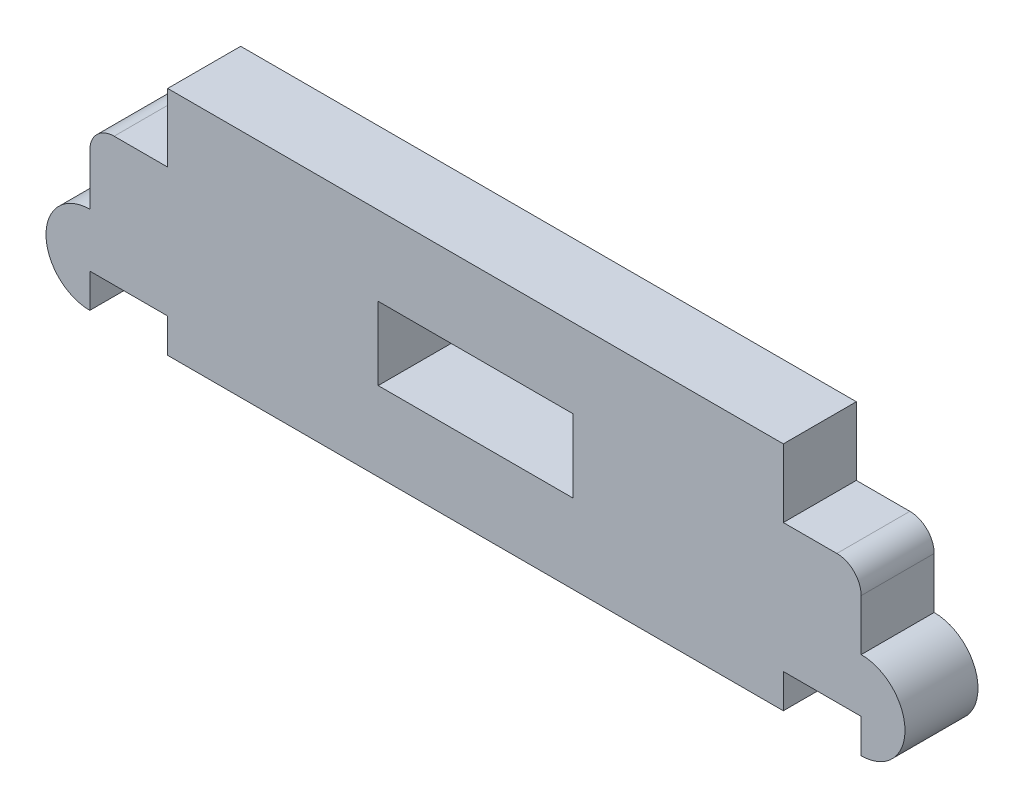
ISO-10303-21;
HEADER;
FILE_DESCRIPTION(('STEP AP214'),'2;1');
FILE_NAME('part.step','',(''),(''),'','','');
FILE_SCHEMA(('AUTOMOTIVE_DESIGN { 1 0 10303 214 1 1 1 1 }'));
ENDSEC;
DATA;
#1=APPLICATION_CONTEXT('core data for automotive mechanical design processes');
#2=APPLICATION_PROTOCOL_DEFINITION('international standard','automotive_design',2000,#1);
#3=PRODUCT_CONTEXT('',#1,'mechanical');
#4=PRODUCT('Part','Part','',(#3));
#5=PRODUCT_RELATED_PRODUCT_CATEGORY('part','',(#4));
#6=PRODUCT_DEFINITION_FORMATION('','',#4);
#7=PRODUCT_DEFINITION_CONTEXT('part definition',#1,'design');
#8=PRODUCT_DEFINITION('design','',#6,#7);
#9=PRODUCT_DEFINITION_SHAPE('','',#8);
#10=(LENGTH_UNIT() NAMED_UNIT(*) SI_UNIT(.MILLI.,.METRE.));
#11=(NAMED_UNIT(*) PLANE_ANGLE_UNIT() SI_UNIT($,.RADIAN.));
#12=(NAMED_UNIT(*) SI_UNIT($,.STERADIAN.) SOLID_ANGLE_UNIT());
#13=UNCERTAINTY_MEASURE_WITH_UNIT(LENGTH_MEASURE(1.E-05),#10,'distance_accuracy_value','');
#14=(GEOMETRIC_REPRESENTATION_CONTEXT(3) GLOBAL_UNCERTAINTY_ASSIGNED_CONTEXT((#13)) GLOBAL_UNIT_ASSIGNED_CONTEXT((#10,
#11,#12)) REPRESENTATION_CONTEXT('',''));
#15=CARTESIAN_POINT('',(0.,0.,0.));
#16=DIRECTION('',(0.,0.,1.));
#17=DIRECTION('',(1.,0.,0.));
#18=AXIS2_PLACEMENT_3D('',#15,#16,#17);
#19=CARTESIAN_POINT('',(12.65,-4.75,3.));
#20=DIRECTION('',(-1.,0.,0.));
#21=DIRECTION('',(0.,0.,1.));
#22=AXIS2_PLACEMENT_3D('',#19,#20,#21);
#23=PLANE('',#22);
#24=DIRECTION('',(0.,0.,-1.));
#25=VECTOR('',#24,1.);
#26=CARTESIAN_POINT('',(12.65,-3.35,3.));
#27=LINE('',#26,#25);
#28=CARTESIAN_POINT('',(12.65,-3.35,3.));
#29=VERTEX_POINT('',#28);
#30=CARTESIAN_POINT('',(12.65,-3.35,0.));
#31=VERTEX_POINT('',#30);
#32=EDGE_CURVE('E182',#29,#31,#27,.T.);
#33=ORIENTED_EDGE('',*,*,#32,.F.);
#34=DIRECTION('',(0.,1.,0.));
#35=VECTOR('',#34,1.);
#36=CARTESIAN_POINT('',(12.65,-4.75,3.));
#37=LINE('',#36,#35);
#38=CARTESIAN_POINT('',(12.65,-4.75,3.));
#39=VERTEX_POINT('',#38);
#40=EDGE_CURVE('E196',#39,#29,#37,.T.);
#41=ORIENTED_EDGE('',*,*,#40,.F.);
#42=DIRECTION('',(0.,0.,-1.));
#43=VECTOR('',#42,1.);
#44=CARTESIAN_POINT('',(12.65,-4.75,3.));
#45=LINE('',#44,#43);
#46=CARTESIAN_POINT('',(12.65,-4.75,0.));
#47=VERTEX_POINT('',#46);
#48=EDGE_CURVE('E220',#39,#47,#45,.T.);
#49=ORIENTED_EDGE('',*,*,#48,.T.);
#50=DIRECTION('',(0.,1.,0.));
#51=VECTOR('',#50,1.);
#52=CARTESIAN_POINT('',(12.65,-4.75,0.));
#53=LINE('',#52,#51);
#54=EDGE_CURVE('E198',#47,#31,#53,.T.);
#55=ORIENTED_EDGE('',*,*,#54,.T.);
#56=EDGE_LOOP('',(#33,#41,#49,#55));
#57=FACE_BOUND('',#56,.T.);
#58=ADVANCED_FACE('F32',(#57),#23,.F.);
#59=CARTESIAN_POINT('',(-12.65,-4.75,3.));
#60=DIRECTION('',(1.,0.,0.));
#61=DIRECTION('',(0.,0.,-1.));
#62=AXIS2_PLACEMENT_3D('',#59,#60,#61);
#63=PLANE('',#62);
#64=DIRECTION('',(0.,0.,-1.));
#65=VECTOR('',#64,1.);
#66=CARTESIAN_POINT('',(-12.65,1.95,3.));
#67=LINE('',#66,#65);
#68=CARTESIAN_POINT('',(-12.65,1.95,3.));
#69=VERTEX_POINT('',#68);
#70=CARTESIAN_POINT('',(-12.65,1.95,0.));
#71=VERTEX_POINT('',#70);
#72=EDGE_CURVE('E312',#69,#71,#67,.T.);
#73=ORIENTED_EDGE('',*,*,#72,.F.);
#74=DIRECTION('',(0.,-1.,0.));
#75=VECTOR('',#74,1.);
#76=CARTESIAN_POINT('',(-12.65,-4.75,3.));
#77=LINE('',#76,#75);
#78=CARTESIAN_POINT('',(-12.65,4.75,3.));
#79=VERTEX_POINT('',#78);
#80=EDGE_CURVE('E216',#79,#69,#77,.T.);
#81=ORIENTED_EDGE('',*,*,#80,.F.);
#82=DIRECTION('',(0.,0.,-1.));
#83=VECTOR('',#82,1.);
#84=CARTESIAN_POINT('',(-12.65,4.75,3.));
#85=LINE('',#84,#83);
#86=CARTESIAN_POINT('',(-12.65,4.75,0.));
#87=VERTEX_POINT('',#86);
#88=EDGE_CURVE('E234',#79,#87,#85,.T.);
#89=ORIENTED_EDGE('',*,*,#88,.T.);
#90=DIRECTION('',(0.,-1.,0.));
#91=VECTOR('',#90,1.);
#92=CARTESIAN_POINT('',(-12.65,-4.75,0.));
#93=LINE('',#92,#91);
#94=EDGE_CURVE('E226',#87,#71,#93,.T.);
#95=ORIENTED_EDGE('',*,*,#94,.T.);
#96=EDGE_LOOP('',(#73,#81,#89,#95));
#97=FACE_BOUND('',#96,.T.);
#98=ADVANCED_FACE('F414',(#97),#63,.F.);
#99=CARTESIAN_POINT('',(0.,0.,3.));
#100=DIRECTION('',(0.,0.,-1.));
#101=DIRECTION('',(-1.,0.,0.));
#102=AXIS2_PLACEMENT_3D('',#99,#100,#101);
#103=PLANE('',#102);
#104=DIRECTION('',(0.,-1.,0.));
#105=VECTOR('',#104,1.);
#106=CARTESIAN_POINT('',(15.85,-1.15,3.));
#107=LINE('',#106,#105);
#108=CARTESIAN_POINT('',(15.85,0.95,3.));
#109=VERTEX_POINT('',#108);
#110=CARTESIAN_POINT('',(15.85,-1.15,3.));
#111=VERTEX_POINT('',#110);
#112=EDGE_CURVE('E357',#109,#111,#107,.T.);
#113=ORIENTED_EDGE('',*,*,#112,.F.);
#114=CARTESIAN_POINT('',(14.85,0.95,3.));
#115=DIRECTION('',(0.,0.,-1.));
#116=DIRECTION('',(-1.,0.,0.));
#117=AXIS2_PLACEMENT_3D('',#114,#115,#116);
#118=CIRCLE('',#117,1.);
#119=CARTESIAN_POINT('',(14.85,1.95,3.));
#120=VERTEX_POINT('',#119);
#121=EDGE_CURVE('E11',#109,#120,#118,.F.);
#122=ORIENTED_EDGE('',*,*,#121,.T.);
#123=DIRECTION('',(1.,0.,0.));
#124=VECTOR('',#123,1.);
#125=CARTESIAN_POINT('',(15.85,1.95,3.));
#126=LINE('',#125,#124);
#127=CARTESIAN_POINT('',(12.65,1.95,3.));
#128=VERTEX_POINT('',#127);
#129=EDGE_CURVE('E258',#128,#120,#126,.T.);
#130=ORIENTED_EDGE('',*,*,#129,.F.);
#131=CARTESIAN_POINT('',(12.65,4.75,3.));
#132=VERTEX_POINT('',#131);
#133=EDGE_CURVE('E207',#128,#132,#37,.T.);
#134=ORIENTED_EDGE('',*,*,#133,.T.);
#135=DIRECTION('',(-1.,0.,0.));
#136=VECTOR('',#135,1.);
#137=CARTESIAN_POINT('',(-12.65,4.75,3.));
#138=LINE('',#137,#136);
#139=EDGE_CURVE('E206',#132,#79,#138,.T.);
#140=ORIENTED_EDGE('',*,*,#139,.T.);
#141=ORIENTED_EDGE('',*,*,#80,.T.);
#142=DIRECTION('',(-1.,0.,0.));
#143=VECTOR('',#142,1.);
#144=CARTESIAN_POINT('',(-15.85,1.95,3.));
#145=LINE('',#144,#143);
#146=CARTESIAN_POINT('',(-14.85,1.95,3.));
#147=VERTEX_POINT('',#146);
#148=EDGE_CURVE('E279',#69,#147,#145,.T.);
#149=ORIENTED_EDGE('',*,*,#148,.T.);
#150=CARTESIAN_POINT('',(-14.85,0.95,3.));
#151=DIRECTION('',(0.,0.,-1.));
#152=DIRECTION('',(-1.,0.,0.));
#153=AXIS2_PLACEMENT_3D('',#150,#151,#152);
#154=CIRCLE('',#153,1.);
#155=CARTESIAN_POINT('',(-15.85,0.95,3.));
#156=VERTEX_POINT('',#155);
#157=EDGE_CURVE('E247',#147,#156,#154,.F.);
#158=ORIENTED_EDGE('',*,*,#157,.T.);
#159=DIRECTION('',(0.,-1.,0.));
#160=VECTOR('',#159,1.);
#161=CARTESIAN_POINT('',(-15.85,-1.15,3.));
#162=LINE('',#161,#160);
#163=CARTESIAN_POINT('',(-15.85,-1.15,3.));
#164=VERTEX_POINT('',#163);
#165=EDGE_CURVE('E282',#156,#164,#162,.T.);
#166=ORIENTED_EDGE('',*,*,#165,.T.);
#167=CARTESIAN_POINT('',(-15.85,-2.95,3.));
#168=DIRECTION('',(0.,0.,1.));
#169=DIRECTION('',(-1.,0.,0.));
#170=AXIS2_PLACEMENT_3D('',#167,#168,#169);
#171=CIRCLE('',#170,1.8);
#172=CARTESIAN_POINT('',(-15.85,-4.75,3.));
#173=VERTEX_POINT('',#172);
#174=EDGE_CURVE('E285',#164,#173,#171,.T.);
#175=ORIENTED_EDGE('',*,*,#174,.T.);
#176=DIRECTION('',(0.,1.,0.));
#177=VECTOR('',#176,1.);
#178=CARTESIAN_POINT('',(-15.85,-3.35,3.));
#179=LINE('',#178,#177);
#180=CARTESIAN_POINT('',(-15.85,-3.35,3.));
#181=VERTEX_POINT('',#180);
#182=EDGE_CURVE('E287',#173,#181,#179,.T.);
#183=ORIENTED_EDGE('',*,*,#182,.T.);
#184=DIRECTION('',(1.,0.,0.));
#185=VECTOR('',#184,1.);
#186=CARTESIAN_POINT('',(-12.65,-3.35,3.));
#187=LINE('',#186,#185);
#188=CARTESIAN_POINT('',(-12.65,-3.35,3.));
#189=VERTEX_POINT('',#188);
#190=EDGE_CURVE('E289',#181,#189,#187,.T.);
#191=ORIENTED_EDGE('',*,*,#190,.T.);
#192=CARTESIAN_POINT('',(-12.65,-4.75,3.));
#193=VERTEX_POINT('',#192);
#194=EDGE_CURVE('E209',#189,#193,#77,.T.);
#195=ORIENTED_EDGE('',*,*,#194,.T.);
#196=DIRECTION('',(1.,0.,0.));
#197=VECTOR('',#196,1.);
#198=CARTESIAN_POINT('',(-12.65,-4.75,3.));
#199=LINE('',#198,#197);
#200=EDGE_CURVE('E204',#193,#39,#199,.T.);
#201=ORIENTED_EDGE('',*,*,#200,.T.);
#202=ORIENTED_EDGE('',*,*,#40,.T.);
#203=DIRECTION('',(-1.,0.,0.));
#204=VECTOR('',#203,1.);
#205=CARTESIAN_POINT('',(12.65,-3.35,3.));
#206=LINE('',#205,#204);
#207=CARTESIAN_POINT('',(15.85,-3.35,3.));
#208=VERTEX_POINT('',#207);
#209=EDGE_CURVE('E178',#208,#29,#206,.T.);
#210=ORIENTED_EDGE('',*,*,#209,.F.);
#211=DIRECTION('',(0.,1.,0.));
#212=VECTOR('',#211,1.);
#213=CARTESIAN_POINT('',(15.85,-3.35,3.));
#214=LINE('',#213,#212);
#215=CARTESIAN_POINT('',(15.85,-4.75,3.));
#216=VERTEX_POINT('',#215);
#217=EDGE_CURVE('E189',#216,#208,#214,.T.);
#218=ORIENTED_EDGE('',*,*,#217,.F.);
#219=CARTESIAN_POINT('',(15.85,-2.95,3.));
#220=DIRECTION('',(0.,0.,-1.));
#221=DIRECTION('',(1.,0.,0.));
#222=AXIS2_PLACEMENT_3D('',#219,#220,#221);
#223=CIRCLE('',#222,1.8);
#224=EDGE_CURVE('E359',#111,#216,#223,.T.);
#225=ORIENTED_EDGE('',*,*,#224,.F.);
#226=EDGE_LOOP('',(#113,#122,#130,#134,#140,#141,#149,#158,#166,#175,#183,#191,#195,#201,#202,
#210,#218,#225));
#227=FACE_BOUND('',#226,.T.);
#228=DIRECTION('',(0.,1.,0.));
#229=VECTOR('',#228,1.);
#230=CARTESIAN_POINT('',(4.,-1.5,3.));
#231=LINE('',#230,#229);
#232=CARTESIAN_POINT('',(4.,-1.5,3.));
#233=VERTEX_POINT('',#232);
#234=CARTESIAN_POINT('',(4.,1.5,3.));
#235=VERTEX_POINT('',#234);
#236=EDGE_CURVE('E316',#233,#235,#231,.T.);
#237=ORIENTED_EDGE('',*,*,#236,.F.);
#238=DIRECTION('',(1.,0.,0.));
#239=VECTOR('',#238,1.);
#240=CARTESIAN_POINT('',(-4.,-1.5,3.));
#241=LINE('',#240,#239);
#242=CARTESIAN_POINT('',(-4.,-1.5,3.));
#243=VERTEX_POINT('',#242);
#244=EDGE_CURVE('E324',#243,#233,#241,.T.);
#245=ORIENTED_EDGE('',*,*,#244,.F.);
#246=DIRECTION('',(0.,-1.,0.));
#247=VECTOR('',#246,1.);
#248=CARTESIAN_POINT('',(-4.,-1.5,3.));
#249=LINE('',#248,#247);
#250=CARTESIAN_POINT('',(-4.,1.5,3.));
#251=VERTEX_POINT('',#250);
#252=EDGE_CURVE('E321',#251,#243,#249,.T.);
#253=ORIENTED_EDGE('',*,*,#252,.F.);
#254=DIRECTION('',(-1.,0.,0.));
#255=VECTOR('',#254,1.);
#256=CARTESIAN_POINT('',(-4.,1.5,3.));
#257=LINE('',#256,#255);
#258=EDGE_CURVE('E318',#235,#251,#257,.T.);
#259=ORIENTED_EDGE('',*,*,#258,.F.);
#260=EDGE_LOOP('',(#237,#245,#253,#259));
#261=FACE_BOUND('',#260,.T.);
#262=ADVANCED_FACE('F201',(#227,#261),#103,.F.);
#263=CARTESIAN_POINT('',(0.,0.,0.));
#264=DIRECTION('',(0.,0.,-1.));
#265=DIRECTION('',(-1.,0.,0.));
#266=AXIS2_PLACEMENT_3D('',#263,#264,#265);
#267=PLANE('',#266);
#268=DIRECTION('',(1.,0.,0.));
#269=VECTOR('',#268,1.);
#270=CARTESIAN_POINT('',(15.85,1.95,0.));
#271=LINE('',#270,#269);
#272=CARTESIAN_POINT('',(12.65,1.95,0.));
#273=VERTEX_POINT('',#272);
#274=CARTESIAN_POINT('',(14.85,1.95,0.));
#275=VERTEX_POINT('',#274);
#276=EDGE_CURVE('E190',#273,#275,#271,.T.);
#277=ORIENTED_EDGE('',*,*,#276,.T.);
#278=CARTESIAN_POINT('',(14.85,0.95,0.));
#279=DIRECTION('',(0.,0.,-1.));
#280=DIRECTION('',(-1.,0.,0.));
#281=AXIS2_PLACEMENT_3D('',#278,#279,#280);
#282=CIRCLE('',#281,1.);
#283=CARTESIAN_POINT('',(15.85,0.95,0.));
#284=VERTEX_POINT('',#283);
#285=EDGE_CURVE('E54',#275,#284,#282,.T.);
#286=ORIENTED_EDGE('',*,*,#285,.T.);
#287=DIRECTION('',(0.,-1.,0.));
#288=VECTOR('',#287,1.);
#289=CARTESIAN_POINT('',(15.85,-1.15,0.));
#290=LINE('',#289,#288);
#291=CARTESIAN_POINT('',(15.85,-1.15,0.));
#292=VERTEX_POINT('',#291);
#293=EDGE_CURVE('E265',#284,#292,#290,.T.);
#294=ORIENTED_EDGE('',*,*,#293,.T.);
#295=CARTESIAN_POINT('',(15.85,-2.95,0.));
#296=DIRECTION('',(0.,0.,-1.));
#297=DIRECTION('',(1.,0.,0.));
#298=AXIS2_PLACEMENT_3D('',#295,#296,#297);
#299=CIRCLE('',#298,1.8);
#300=CARTESIAN_POINT('',(15.85,-4.75,0.));
#301=VERTEX_POINT('',#300);
#302=EDGE_CURVE('E267',#292,#301,#299,.T.);
#303=ORIENTED_EDGE('',*,*,#302,.T.);
#304=DIRECTION('',(0.,1.,0.));
#305=VECTOR('',#304,1.);
#306=CARTESIAN_POINT('',(15.85,-3.35,0.));
#307=LINE('',#306,#305);
#308=CARTESIAN_POINT('',(15.85,-3.35,0.));
#309=VERTEX_POINT('',#308);
#310=EDGE_CURVE('E365',#301,#309,#307,.T.);
#311=ORIENTED_EDGE('',*,*,#310,.T.);
#312=DIRECTION('',(-1.,0.,0.));
#313=VECTOR('',#312,1.);
#314=CARTESIAN_POINT('',(12.65,-3.35,0.));
#315=LINE('',#314,#313);
#316=EDGE_CURVE('E363',#309,#31,#315,.T.);
#317=ORIENTED_EDGE('',*,*,#316,.T.);
#318=ORIENTED_EDGE('',*,*,#54,.F.);
#319=DIRECTION('',(1.,0.,0.));
#320=VECTOR('',#319,1.);
#321=CARTESIAN_POINT('',(-12.65,-4.75,0.));
#322=LINE('',#321,#320);
#323=CARTESIAN_POINT('',(-12.65,-4.75,0.));
#324=VERTEX_POINT('',#323);
#325=EDGE_CURVE('E211',#324,#47,#322,.T.);
#326=ORIENTED_EDGE('',*,*,#325,.F.);
#327=CARTESIAN_POINT('',(-12.65,-3.35,0.));
#328=VERTEX_POINT('',#327);
#329=EDGE_CURVE('E225',#328,#324,#93,.T.);
#330=ORIENTED_EDGE('',*,*,#329,.F.);
#331=DIRECTION('',(1.,0.,0.));
#332=VECTOR('',#331,1.);
#333=CARTESIAN_POINT('',(-12.65,-3.35,0.));
#334=LINE('',#333,#332);
#335=CARTESIAN_POINT('',(-15.85,-3.35,0.));
#336=VERTEX_POINT('',#335);
#337=EDGE_CURVE('E283',#336,#328,#334,.T.);
#338=ORIENTED_EDGE('',*,*,#337,.F.);
#339=DIRECTION('',(0.,1.,0.));
#340=VECTOR('',#339,1.);
#341=CARTESIAN_POINT('',(-15.85,-3.35,0.));
#342=LINE('',#341,#340);
#343=CARTESIAN_POINT('',(-15.85,-4.75,0.));
#344=VERTEX_POINT('',#343);
#345=EDGE_CURVE('E298',#344,#336,#342,.T.);
#346=ORIENTED_EDGE('',*,*,#345,.F.);
#347=CARTESIAN_POINT('',(-15.85,-2.95,0.));
#348=DIRECTION('',(0.,0.,1.));
#349=DIRECTION('',(-1.,0.,0.));
#350=AXIS2_PLACEMENT_3D('',#347,#348,#349);
#351=CIRCLE('',#350,1.8);
#352=CARTESIAN_POINT('',(-15.85,-1.15,0.));
#353=VERTEX_POINT('',#352);
#354=EDGE_CURVE('E296',#353,#344,#351,.T.);
#355=ORIENTED_EDGE('',*,*,#354,.F.);
#356=DIRECTION('',(0.,-1.,0.));
#357=VECTOR('',#356,1.);
#358=CARTESIAN_POINT('',(-15.85,-1.15,0.));
#359=LINE('',#358,#357);
#360=CARTESIAN_POINT('',(-15.85,0.95,0.));
#361=VERTEX_POINT('',#360);
#362=EDGE_CURVE('E294',#361,#353,#359,.T.);
#363=ORIENTED_EDGE('',*,*,#362,.F.);
#364=CARTESIAN_POINT('',(-14.85,0.95,0.));
#365=DIRECTION('',(0.,0.,-1.));
#366=DIRECTION('',(-1.,0.,0.));
#367=AXIS2_PLACEMENT_3D('',#364,#365,#366);
#368=CIRCLE('',#367,1.);
#369=CARTESIAN_POINT('',(-14.85,1.95,0.));
#370=VERTEX_POINT('',#369);
#371=EDGE_CURVE('E243',#361,#370,#368,.T.);
#372=ORIENTED_EDGE('',*,*,#371,.T.);
#373=DIRECTION('',(-1.,0.,0.));
#374=VECTOR('',#373,1.);
#375=CARTESIAN_POINT('',(-15.85,1.95,0.));
#376=LINE('',#375,#374);
#377=EDGE_CURVE('E199',#71,#370,#376,.T.);
#378=ORIENTED_EDGE('',*,*,#377,.F.);
#379=ORIENTED_EDGE('',*,*,#94,.F.);
#380=DIRECTION('',(-1.,0.,0.));
#381=VECTOR('',#380,1.);
#382=CARTESIAN_POINT('',(-12.65,4.75,0.));
#383=LINE('',#382,#381);
#384=CARTESIAN_POINT('',(12.65,4.75,0.));
#385=VERTEX_POINT('',#384);
#386=EDGE_CURVE('E222',#385,#87,#383,.T.);
#387=ORIENTED_EDGE('',*,*,#386,.F.);
#388=EDGE_CURVE('E223',#273,#385,#53,.T.);
#389=ORIENTED_EDGE('',*,*,#388,.F.);
#390=EDGE_LOOP('',(#277,#286,#294,#303,#311,#317,#318,#326,#330,#338,#346,#355,#363,#372,#378,
#379,#387,#389));
#391=FACE_BOUND('',#390,.T.);
#392=DIRECTION('',(1.,0.,0.));
#393=VECTOR('',#392,1.);
#394=CARTESIAN_POINT('',(-4.,-1.5,0.));
#395=LINE('',#394,#393);
#396=CARTESIAN_POINT('',(-4.,-1.5,0.));
#397=VERTEX_POINT('',#396);
#398=CARTESIAN_POINT('',(4.,-1.5,0.));
#399=VERTEX_POINT('',#398);
#400=EDGE_CURVE('E319',#397,#399,#395,.T.);
#401=ORIENTED_EDGE('',*,*,#400,.T.);
#402=DIRECTION('',(0.,1.,0.));
#403=VECTOR('',#402,1.);
#404=CARTESIAN_POINT('',(4.,-1.5,0.));
#405=LINE('',#404,#403);
#406=CARTESIAN_POINT('',(4.,1.5,0.));
#407=VERTEX_POINT('',#406);
#408=EDGE_CURVE('E315',#399,#407,#405,.T.);
#409=ORIENTED_EDGE('',*,*,#408,.T.);
#410=DIRECTION('',(-1.,0.,0.));
#411=VECTOR('',#410,1.);
#412=CARTESIAN_POINT('',(-4.,1.5,0.));
#413=LINE('',#412,#411);
#414=CARTESIAN_POINT('',(-4.,1.5,0.));
#415=VERTEX_POINT('',#414);
#416=EDGE_CURVE('E329',#407,#415,#413,.T.);
#417=ORIENTED_EDGE('',*,*,#416,.T.);
#418=DIRECTION('',(0.,-1.,0.));
#419=VECTOR('',#418,1.);
#420=CARTESIAN_POINT('',(-4.,-1.5,0.));
#421=LINE('',#420,#419);
#422=EDGE_CURVE('E332',#415,#397,#421,.T.);
#423=ORIENTED_EDGE('',*,*,#422,.T.);
#424=EDGE_LOOP('',(#401,#409,#417,#423));
#425=FACE_BOUND('',#424,.T.);
#426=ADVANCED_FACE('F262',(#391,#425),#267,.T.);
#427=ORIENTED_EDGE('',*,*,#133,.F.);
#428=DIRECTION('',(0.,0.,-1.));
#429=VECTOR('',#428,1.);
#430=CARTESIAN_POINT('',(12.65,1.95,3.));
#431=LINE('',#430,#429);
#432=EDGE_CURVE('E271',#128,#273,#431,.T.);
#433=ORIENTED_EDGE('',*,*,#432,.T.);
#434=ORIENTED_EDGE('',*,*,#388,.T.);
#435=DIRECTION('',(0.,0.,-1.));
#436=VECTOR('',#435,1.);
#437=CARTESIAN_POINT('',(12.65,4.75,3.));
#438=LINE('',#437,#436);
#439=EDGE_CURVE('E237',#132,#385,#438,.T.);
#440=ORIENTED_EDGE('',*,*,#439,.F.);
#441=EDGE_LOOP('',(#427,#433,#434,#440));
#442=FACE_BOUND('',#441,.T.);
#443=ADVANCED_FACE('F350',(#442),#23,.F.);
#444=CARTESIAN_POINT('',(-12.65,4.75,3.));
#445=DIRECTION('',(0.,-1.,0.));
#446=DIRECTION('',(0.,0.,-1.));
#447=AXIS2_PLACEMENT_3D('',#444,#445,#446);
#448=PLANE('',#447);
#449=ORIENTED_EDGE('',*,*,#386,.T.);
#450=ORIENTED_EDGE('',*,*,#88,.F.);
#451=ORIENTED_EDGE('',*,*,#139,.F.);
#452=ORIENTED_EDGE('',*,*,#439,.T.);
#453=EDGE_LOOP('',(#449,#450,#451,#452));
#454=FACE_BOUND('',#453,.T.);
#455=ADVANCED_FACE('F355',(#454),#448,.F.);
#456=ORIENTED_EDGE('',*,*,#194,.F.);
#457=DIRECTION('',(0.,0.,-1.));
#458=VECTOR('',#457,1.);
#459=CARTESIAN_POINT('',(-12.65,-3.35,3.));
#460=LINE('',#459,#458);
#461=EDGE_CURVE('E291',#189,#328,#460,.T.);
#462=ORIENTED_EDGE('',*,*,#461,.T.);
#463=ORIENTED_EDGE('',*,*,#329,.T.);
#464=DIRECTION('',(0.,0.,-1.));
#465=VECTOR('',#464,1.);
#466=CARTESIAN_POINT('',(-12.65,-4.75,3.));
#467=LINE('',#466,#465);
#468=EDGE_CURVE('E231',#193,#324,#467,.T.);
#469=ORIENTED_EDGE('',*,*,#468,.F.);
#470=EDGE_LOOP('',(#456,#462,#463,#469));
#471=FACE_BOUND('',#470,.T.);
#472=ADVANCED_FACE('F385',(#471),#63,.F.);
#473=CARTESIAN_POINT('',(-12.65,-4.75,3.));
#474=DIRECTION('',(0.,1.,0.));
#475=DIRECTION('',(0.,0.,1.));
#476=AXIS2_PLACEMENT_3D('',#473,#474,#475);
#477=PLANE('',#476);
#478=ORIENTED_EDGE('',*,*,#325,.T.);
#479=ORIENTED_EDGE('',*,*,#48,.F.);
#480=ORIENTED_EDGE('',*,*,#200,.F.);
#481=ORIENTED_EDGE('',*,*,#468,.T.);
#482=EDGE_LOOP('',(#478,#479,#480,#481));
#483=FACE_BOUND('',#482,.T.);
#484=ADVANCED_FACE('F381',(#483),#477,.F.);
#485=CARTESIAN_POINT('',(4.,-1.5,3.));
#486=DIRECTION('',(-1.,0.,0.));
#487=DIRECTION('',(0.,0.,1.));
#488=AXIS2_PLACEMENT_3D('',#485,#486,#487);
#489=PLANE('',#488);
#490=ORIENTED_EDGE('',*,*,#408,.F.);
#491=DIRECTION('',(0.,0.,-1.));
#492=VECTOR('',#491,1.);
#493=CARTESIAN_POINT('',(4.,-1.5,3.));
#494=LINE('',#493,#492);
#495=EDGE_CURVE('E326',#233,#399,#494,.T.);
#496=ORIENTED_EDGE('',*,*,#495,.F.);
#497=ORIENTED_EDGE('',*,*,#236,.T.);
#498=DIRECTION('',(0.,0.,-1.));
#499=VECTOR('',#498,1.);
#500=CARTESIAN_POINT('',(4.,1.5,3.));
#501=LINE('',#500,#499);
#502=EDGE_CURVE('E213',#235,#407,#501,.T.);
#503=ORIENTED_EDGE('',*,*,#502,.T.);
#504=EDGE_LOOP('',(#490,#496,#497,#503));
#505=FACE_BOUND('',#504,.T.);
#506=ADVANCED_FACE('F430',(#505),#489,.T.);
#507=CARTESIAN_POINT('',(-4.,1.5,3.));
#508=DIRECTION('',(0.,-1.,0.));
#509=DIRECTION('',(0.,0.,-1.));
#510=AXIS2_PLACEMENT_3D('',#507,#508,#509);
#511=PLANE('',#510);
#512=ORIENTED_EDGE('',*,*,#416,.F.);
#513=ORIENTED_EDGE('',*,*,#502,.F.);
#514=ORIENTED_EDGE('',*,*,#258,.T.);
#515=DIRECTION('',(0.,0.,-1.));
#516=VECTOR('',#515,1.);
#517=CARTESIAN_POINT('',(-4.,1.5,3.));
#518=LINE('',#517,#516);
#519=EDGE_CURVE('E340',#251,#415,#518,.T.);
#520=ORIENTED_EDGE('',*,*,#519,.T.);
#521=EDGE_LOOP('',(#512,#513,#514,#520));
#522=FACE_BOUND('',#521,.T.);
#523=ADVANCED_FACE('F460',(#522),#511,.T.);
#524=CARTESIAN_POINT('',(-4.,-1.5,3.));
#525=DIRECTION('',(1.,0.,0.));
#526=DIRECTION('',(0.,0.,-1.));
#527=AXIS2_PLACEMENT_3D('',#524,#525,#526);
#528=PLANE('',#527);
#529=ORIENTED_EDGE('',*,*,#422,.F.);
#530=ORIENTED_EDGE('',*,*,#519,.F.);
#531=ORIENTED_EDGE('',*,*,#252,.T.);
#532=DIRECTION('',(0.,0.,-1.));
#533=VECTOR('',#532,1.);
#534=CARTESIAN_POINT('',(-4.,-1.5,3.));
#535=LINE('',#534,#533);
#536=EDGE_CURVE('E339',#243,#397,#535,.T.);
#537=ORIENTED_EDGE('',*,*,#536,.T.);
#538=EDGE_LOOP('',(#529,#530,#531,#537));
#539=FACE_BOUND('',#538,.T.);
#540=ADVANCED_FACE('F456',(#539),#528,.T.);
#541=CARTESIAN_POINT('',(-4.,-1.5,3.));
#542=DIRECTION('',(0.,1.,0.));
#543=DIRECTION('',(0.,0.,1.));
#544=AXIS2_PLACEMENT_3D('',#541,#542,#543);
#545=PLANE('',#544);
#546=ORIENTED_EDGE('',*,*,#400,.F.);
#547=ORIENTED_EDGE('',*,*,#536,.F.);
#548=ORIENTED_EDGE('',*,*,#244,.T.);
#549=ORIENTED_EDGE('',*,*,#495,.T.);
#550=EDGE_LOOP('',(#546,#547,#548,#549));
#551=FACE_BOUND('',#550,.T.);
#552=ADVANCED_FACE('F453',(#551),#545,.T.);
#553=CARTESIAN_POINT('',(-15.85,1.95,3.));
#554=DIRECTION('',(0.,-1.,0.));
#555=DIRECTION('',(0.,0.,-1.));
#556=AXIS2_PLACEMENT_3D('',#553,#554,#555);
#557=PLANE('',#556);
#558=ORIENTED_EDGE('',*,*,#377,.T.);
#559=DIRECTION('',(0.,0.,-1.));
#560=VECTOR('',#559,1.);
#561=CARTESIAN_POINT('',(-14.85,1.95,3.));
#562=LINE('',#561,#560);
#563=EDGE_CURVE('E245',#370,#147,#562,.F.);
#564=ORIENTED_EDGE('',*,*,#563,.T.);
#565=ORIENTED_EDGE('',*,*,#148,.F.);
#566=ORIENTED_EDGE('',*,*,#72,.T.);
#567=EDGE_LOOP('',(#558,#564,#565,#566));
#568=FACE_BOUND('',#567,.T.);
#569=ADVANCED_FACE('F409',(#568),#557,.F.);
#570=CARTESIAN_POINT('',(-15.85,-1.15,3.));
#571=DIRECTION('',(1.,0.,0.));
#572=DIRECTION('',(0.,0.,-1.));
#573=AXIS2_PLACEMENT_3D('',#570,#571,#572);
#574=PLANE('',#573);
#575=ORIENTED_EDGE('',*,*,#165,.F.);
#576=DIRECTION('',(0.,0.,-1.));
#577=VECTOR('',#576,1.);
#578=CARTESIAN_POINT('',(-15.85,0.95,3.));
#579=LINE('',#578,#577);
#580=EDGE_CURVE('E240',#156,#361,#579,.T.);
#581=ORIENTED_EDGE('',*,*,#580,.T.);
#582=ORIENTED_EDGE('',*,*,#362,.T.);
#583=DIRECTION('',(0.,0.,-1.));
#584=VECTOR('',#583,1.);
#585=CARTESIAN_POINT('',(-15.85,-1.15,3.));
#586=LINE('',#585,#584);
#587=EDGE_CURVE('E309',#164,#353,#586,.T.);
#588=ORIENTED_EDGE('',*,*,#587,.F.);
#589=EDGE_LOOP('',(#575,#581,#582,#588));
#590=FACE_BOUND('',#589,.T.);
#591=ADVANCED_FACE('F404',(#590),#574,.F.);
#592=CARTESIAN_POINT('',(-15.85,-2.95,3.));
#593=DIRECTION('',(0.,0.,-1.));
#594=DIRECTION('',(-1.,0.,0.));
#595=AXIS2_PLACEMENT_3D('',#592,#593,#594);
#596=CYLINDRICAL_SURFACE('',#595,1.8);
#597=ORIENTED_EDGE('',*,*,#354,.T.);
#598=DIRECTION('',(0.,0.,-1.));
#599=VECTOR('',#598,1.);
#600=CARTESIAN_POINT('',(-15.85,-4.75,3.));
#601=LINE('',#600,#599);
#602=EDGE_CURVE('E306',#173,#344,#601,.T.);
#603=ORIENTED_EDGE('',*,*,#602,.F.);
#604=ORIENTED_EDGE('',*,*,#174,.F.);
#605=ORIENTED_EDGE('',*,*,#587,.T.);
#606=EDGE_LOOP('',(#597,#603,#604,#605));
#607=FACE_BOUND('',#606,.T.);
#608=ADVANCED_FACE('F400',(#607),#596,.T.);
#609=CARTESIAN_POINT('',(-15.85,-3.35,3.));
#610=DIRECTION('',(-1.,0.,0.));
#611=DIRECTION('',(0.,0.,1.));
#612=AXIS2_PLACEMENT_3D('',#609,#610,#611);
#613=PLANE('',#612);
#614=ORIENTED_EDGE('',*,*,#345,.T.);
#615=DIRECTION('',(0.,0.,-1.));
#616=VECTOR('',#615,1.);
#617=CARTESIAN_POINT('',(-15.85,-3.35,3.));
#618=LINE('',#617,#616);
#619=EDGE_CURVE('E303',#181,#336,#618,.T.);
#620=ORIENTED_EDGE('',*,*,#619,.F.);
#621=ORIENTED_EDGE('',*,*,#182,.F.);
#622=ORIENTED_EDGE('',*,*,#602,.T.);
#623=EDGE_LOOP('',(#614,#620,#621,#622));
#624=FACE_BOUND('',#623,.T.);
#625=ADVANCED_FACE('F395',(#624),#613,.F.);
#626=CARTESIAN_POINT('',(-12.65,-3.35,3.));
#627=DIRECTION('',(0.,1.,0.));
#628=DIRECTION('',(-1.,0.,0.));
#629=AXIS2_PLACEMENT_3D('',#626,#627,#628);
#630=PLANE('',#629);
#631=ORIENTED_EDGE('',*,*,#337,.T.);
#632=ORIENTED_EDGE('',*,*,#461,.F.);
#633=ORIENTED_EDGE('',*,*,#190,.F.);
#634=ORIENTED_EDGE('',*,*,#619,.T.);
#635=EDGE_LOOP('',(#631,#632,#633,#634));
#636=FACE_BOUND('',#635,.T.);
#637=ADVANCED_FACE('F389',(#636),#630,.F.);
#638=CARTESIAN_POINT('',(-14.85,0.95,3.));
#639=DIRECTION('',(0.,0.,-1.));
#640=DIRECTION('',(-1.,0.,0.));
#641=AXIS2_PLACEMENT_3D('',#638,#639,#640);
#642=CYLINDRICAL_SURFACE('',#641,1.);
#643=ORIENTED_EDGE('',*,*,#157,.F.);
#644=ORIENTED_EDGE('',*,*,#563,.F.);
#645=ORIENTED_EDGE('',*,*,#371,.F.);
#646=ORIENTED_EDGE('',*,*,#580,.F.);
#647=EDGE_LOOP('',(#643,#644,#645,#646));
#648=FACE_BOUND('',#647,.T.);
#649=ADVANCED_FACE('F412',(#648),#642,.T.);
#650=CARTESIAN_POINT('',(12.65,-3.35,3.));
#651=DIRECTION('',(0.,-1.,0.));
#652=DIRECTION('',(1.,0.,0.));
#653=AXIS2_PLACEMENT_3D('',#650,#651,#652);
#654=PLANE('',#653);
#655=ORIENTED_EDGE('',*,*,#316,.F.);
#656=DIRECTION('',(0.,0.,-1.));
#657=VECTOR('',#656,1.);
#658=CARTESIAN_POINT('',(15.85,-3.35,3.));
#659=LINE('',#658,#657);
#660=EDGE_CURVE('E184',#208,#309,#659,.T.);
#661=ORIENTED_EDGE('',*,*,#660,.F.);
#662=ORIENTED_EDGE('',*,*,#209,.T.);
#663=ORIENTED_EDGE('',*,*,#32,.T.);
#664=EDGE_LOOP('',(#655,#661,#662,#663));
#665=FACE_BOUND('',#664,.T.);
#666=ADVANCED_FACE('F181',(#665),#654,.T.);
#667=CARTESIAN_POINT('',(15.85,-3.35,3.));
#668=DIRECTION('',(-1.,0.,0.));
#669=DIRECTION('',(0.,0.,1.));
#670=AXIS2_PLACEMENT_3D('',#667,#668,#669);
#671=PLANE('',#670);
#672=ORIENTED_EDGE('',*,*,#310,.F.);
#673=DIRECTION('',(0.,0.,-1.));
#674=VECTOR('',#673,1.);
#675=CARTESIAN_POINT('',(15.85,-4.75,3.));
#676=LINE('',#675,#674);
#677=EDGE_CURVE('E276',#216,#301,#676,.T.);
#678=ORIENTED_EDGE('',*,*,#677,.F.);
#679=ORIENTED_EDGE('',*,*,#217,.T.);
#680=ORIENTED_EDGE('',*,*,#660,.T.);
#681=EDGE_LOOP('',(#672,#678,#679,#680));
#682=FACE_BOUND('',#681,.T.);
#683=ADVANCED_FACE('F376',(#682),#671,.T.);
#684=CARTESIAN_POINT('',(15.85,-2.95,3.));
#685=DIRECTION('',(0.,0.,-1.));
#686=DIRECTION('',(-1.,0.,0.));
#687=AXIS2_PLACEMENT_3D('',#684,#685,#686);
#688=CYLINDRICAL_SURFACE('',#687,1.8);
#689=ORIENTED_EDGE('',*,*,#302,.F.);
#690=DIRECTION('',(0.,0.,-1.));
#691=VECTOR('',#690,1.);
#692=CARTESIAN_POINT('',(15.85,-1.15,3.));
#693=LINE('',#692,#691);
#694=EDGE_CURVE('E273',#111,#292,#693,.T.);
#695=ORIENTED_EDGE('',*,*,#694,.F.);
#696=ORIENTED_EDGE('',*,*,#224,.T.);
#697=ORIENTED_EDGE('',*,*,#677,.T.);
#698=EDGE_LOOP('',(#689,#695,#696,#697));
#699=FACE_BOUND('',#698,.T.);
#700=ADVANCED_FACE('F372',(#699),#688,.T.);
#701=CARTESIAN_POINT('',(15.85,-1.15,3.));
#702=DIRECTION('',(1.,0.,0.));
#703=DIRECTION('',(0.,0.,-1.));
#704=AXIS2_PLACEMENT_3D('',#701,#702,#703);
#705=PLANE('',#704);
#706=ORIENTED_EDGE('',*,*,#293,.F.);
#707=DIRECTION('',(0.,0.,-1.));
#708=VECTOR('',#707,1.);
#709=CARTESIAN_POINT('',(15.85,0.95,3.));
#710=LINE('',#709,#708);
#711=EDGE_CURVE('E40',#284,#109,#710,.F.);
#712=ORIENTED_EDGE('',*,*,#711,.T.);
#713=ORIENTED_EDGE('',*,*,#112,.T.);
#714=ORIENTED_EDGE('',*,*,#694,.T.);
#715=EDGE_LOOP('',(#706,#712,#713,#714));
#716=FACE_BOUND('',#715,.T.);
#717=ADVANCED_FACE('F498',(#716),#705,.T.);
#718=CARTESIAN_POINT('',(15.85,1.95,3.));
#719=DIRECTION('',(0.,1.,0.));
#720=DIRECTION('',(0.,0.,1.));
#721=AXIS2_PLACEMENT_3D('',#718,#719,#720);
#722=PLANE('',#721);
#723=ORIENTED_EDGE('',*,*,#129,.T.);
#724=DIRECTION('',(0.,0.,-1.));
#725=VECTOR('',#724,1.);
#726=CARTESIAN_POINT('',(14.85,1.95,3.));
#727=LINE('',#726,#725);
#728=EDGE_CURVE('E249',#120,#275,#727,.T.);
#729=ORIENTED_EDGE('',*,*,#728,.T.);
#730=ORIENTED_EDGE('',*,*,#276,.F.);
#731=ORIENTED_EDGE('',*,*,#432,.F.);
#732=EDGE_LOOP('',(#723,#729,#730,#731));
#733=FACE_BOUND('',#732,.T.);
#734=ADVANCED_FACE('F255',(#733),#722,.T.);
#735=CARTESIAN_POINT('',(14.85,0.95,3.));
#736=DIRECTION('',(0.,0.,-1.));
#737=DIRECTION('',(-1.,0.,0.));
#738=AXIS2_PLACEMENT_3D('',#735,#736,#737);
#739=CYLINDRICAL_SURFACE('',#738,1.);
#740=ORIENTED_EDGE('',*,*,#121,.F.);
#741=ORIENTED_EDGE('',*,*,#711,.F.);
#742=ORIENTED_EDGE('',*,*,#285,.F.);
#743=ORIENTED_EDGE('',*,*,#728,.F.);
#744=EDGE_LOOP('',(#740,#741,#742,#743));
#745=FACE_BOUND('',#744,.T.);
#746=ADVANCED_FACE('F34',(#745),#739,.T.);
#747=CLOSED_SHELL('',(#58,#98,#262,#426,#443,#455,#472,#484,#506,#523,#540,#552,#569,#591,#608,
#625,#637,#649,#666,#683,#700,#717,#734,#746));
#748=MANIFOLD_SOLID_BREP('B2',#747);
#749=ADVANCED_BREP_SHAPE_REPRESENTATION('',(#18,#748),#14);
#750=SHAPE_DEFINITION_REPRESENTATION(#9,#749);
ENDSEC;
END-ISO-10303-21;
